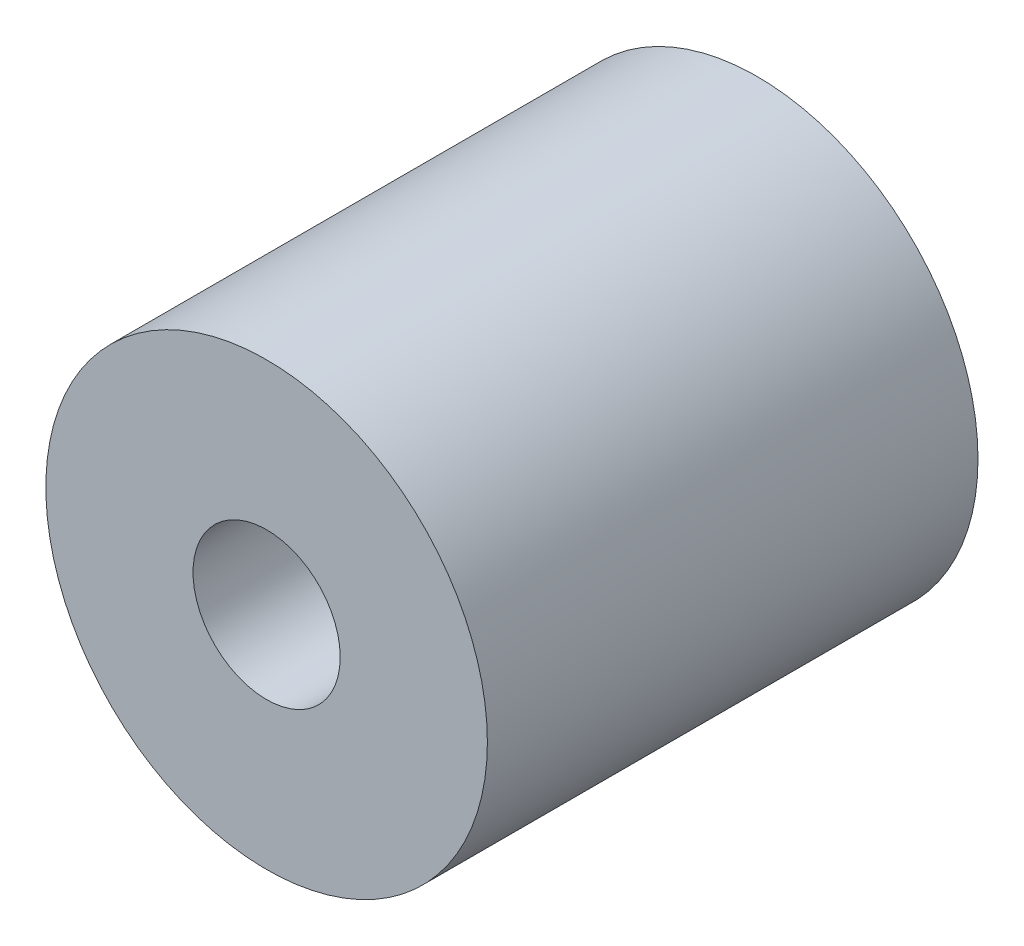
ISO-10303-21;
HEADER;
FILE_DESCRIPTION(('STEP AP214'),'2;1');
FILE_NAME('part.step','',(''),(''),'','','');
FILE_SCHEMA(('AUTOMOTIVE_DESIGN { 1 0 10303 214 1 1 1 1 }'));
ENDSEC;
DATA;
#1=APPLICATION_CONTEXT('core data for automotive mechanical design processes');
#2=APPLICATION_PROTOCOL_DEFINITION('international standard','automotive_design',2000,#1);
#3=PRODUCT_CONTEXT('',#1,'mechanical');
#4=PRODUCT('Part','Part','',(#3));
#5=PRODUCT_RELATED_PRODUCT_CATEGORY('part','',(#4));
#6=PRODUCT_DEFINITION_FORMATION('','',#4);
#7=PRODUCT_DEFINITION_CONTEXT('part definition',#1,'design');
#8=PRODUCT_DEFINITION('design','',#6,#7);
#9=PRODUCT_DEFINITION_SHAPE('','',#8);
#10=(LENGTH_UNIT() NAMED_UNIT(*) SI_UNIT(.MILLI.,.METRE.));
#11=(NAMED_UNIT(*) PLANE_ANGLE_UNIT() SI_UNIT($,.RADIAN.));
#12=(NAMED_UNIT(*) SI_UNIT($,.STERADIAN.) SOLID_ANGLE_UNIT());
#13=UNCERTAINTY_MEASURE_WITH_UNIT(LENGTH_MEASURE(1.E-05),#10,'distance_accuracy_value','');
#14=(GEOMETRIC_REPRESENTATION_CONTEXT(3) GLOBAL_UNCERTAINTY_ASSIGNED_CONTEXT((#13)) GLOBAL_UNIT_ASSIGNED_CONTEXT((#10,
#11,#12)) REPRESENTATION_CONTEXT('',''));
#15=CARTESIAN_POINT('',(0.,0.,0.));
#16=DIRECTION('',(0.,0.,1.));
#17=DIRECTION('',(1.,0.,0.));
#18=AXIS2_PLACEMENT_3D('',#15,#16,#17);
#19=CARTESIAN_POINT('',(0.,0.,10.));
#20=DIRECTION('',(0.,0.,1.));
#21=DIRECTION('',(1.,0.,0.));
#22=AXIS2_PLACEMENT_3D('',#19,#20,#21);
#23=PLANE('',#22);
#24=CARTESIAN_POINT('',(0.,0.,10.));
#25=DIRECTION('',(0.,0.,1.));
#26=DIRECTION('',(1.,0.,0.));
#27=AXIS2_PLACEMENT_3D('',#24,#25,#26);
#28=CIRCLE('',#27,4.5);
#29=CARTESIAN_POINT('',(4.5,0.,10.));
#30=VERTEX_POINT('',#29);
#31=EDGE_CURVE('E10',#30,#30,#28,.T.);
#32=ORIENTED_EDGE('',*,*,#31,.T.);
#33=EDGE_LOOP('',(#32));
#34=FACE_BOUND('',#33,.T.);
#35=CARTESIAN_POINT('',(0.,0.,10.));
#36=DIRECTION('',(0.,0.,1.));
#37=DIRECTION('',(1.,0.,0.));
#38=AXIS2_PLACEMENT_3D('',#35,#36,#37);
#39=CIRCLE('',#38,1.5);
#40=CARTESIAN_POINT('',(1.5,0.,10.));
#41=VERTEX_POINT('',#40);
#42=EDGE_CURVE('E44',#41,#41,#39,.T.);
#43=ORIENTED_EDGE('',*,*,#42,.F.);
#44=EDGE_LOOP('',(#43));
#45=FACE_BOUND('',#44,.T.);
#46=ADVANCED_FACE('F33',(#34,#45),#23,.T.);
#47=CARTESIAN_POINT('',(0.,0.,0.));
#48=DIRECTION('',(0.,0.,1.));
#49=DIRECTION('',(1.,0.,0.));
#50=AXIS2_PLACEMENT_3D('',#47,#48,#49);
#51=PLANE('',#50);
#52=CARTESIAN_POINT('',(0.,0.,0.));
#53=DIRECTION('',(0.,0.,1.));
#54=DIRECTION('',(1.,0.,0.));
#55=AXIS2_PLACEMENT_3D('',#52,#53,#54);
#56=CIRCLE('',#55,4.5);
#57=CARTESIAN_POINT('',(4.5,0.,0.));
#58=VERTEX_POINT('',#57);
#59=EDGE_CURVE('E37',#58,#58,#56,.T.);
#60=ORIENTED_EDGE('',*,*,#59,.F.);
#61=EDGE_LOOP('',(#60));
#62=FACE_BOUND('',#61,.T.);
#63=CARTESIAN_POINT('',(0.,0.,0.));
#64=DIRECTION('',(0.,0.,1.));
#65=DIRECTION('',(1.,0.,0.));
#66=AXIS2_PLACEMENT_3D('',#63,#64,#65);
#67=CIRCLE('',#66,1.5);
#68=CARTESIAN_POINT('',(1.5,0.,0.));
#69=VERTEX_POINT('',#68);
#70=EDGE_CURVE('E46',#69,#69,#67,.T.);
#71=ORIENTED_EDGE('',*,*,#70,.T.);
#72=EDGE_LOOP('',(#71));
#73=FACE_BOUND('',#72,.T.);
#74=ADVANCED_FACE('F56',(#62,#73),#51,.F.);
#75=CARTESIAN_POINT('',(0.,0.,10.));
#76=DIRECTION('',(0.,0.,-1.));
#77=DIRECTION('',(-1.,0.,0.));
#78=AXIS2_PLACEMENT_3D('',#75,#76,#77);
#79=CYLINDRICAL_SURFACE('',#78,4.5);
#80=ORIENTED_EDGE('',*,*,#31,.F.);
#81=EDGE_LOOP('',(#80));
#82=FACE_BOUND('',#81,.T.);
#83=ORIENTED_EDGE('',*,*,#59,.T.);
#84=EDGE_LOOP('',(#83));
#85=FACE_BOUND('',#84,.T.);
#86=ADVANCED_FACE('F35',(#82,#85),#79,.T.);
#87=CARTESIAN_POINT('',(0.,0.,10.));
#88=DIRECTION('',(0.,0.,-1.));
#89=DIRECTION('',(-1.,0.,0.));
#90=AXIS2_PLACEMENT_3D('',#87,#88,#89);
#91=CYLINDRICAL_SURFACE('',#90,1.5);
#92=ORIENTED_EDGE('',*,*,#42,.T.);
#93=EDGE_LOOP('',(#92));
#94=FACE_BOUND('',#93,.T.);
#95=ORIENTED_EDGE('',*,*,#70,.F.);
#96=EDGE_LOOP('',(#95));
#97=FACE_BOUND('',#96,.T.);
#98=ADVANCED_FACE('F52',(#94,#97),#91,.F.);
#99=CLOSED_SHELL('',(#46,#74,#86,#98));
#100=MANIFOLD_SOLID_BREP('B2',#99);
#101=ADVANCED_BREP_SHAPE_REPRESENTATION('',(#18,#100),#14);
#102=SHAPE_DEFINITION_REPRESENTATION(#9,#101);
ENDSEC;
END-ISO-10303-21;
